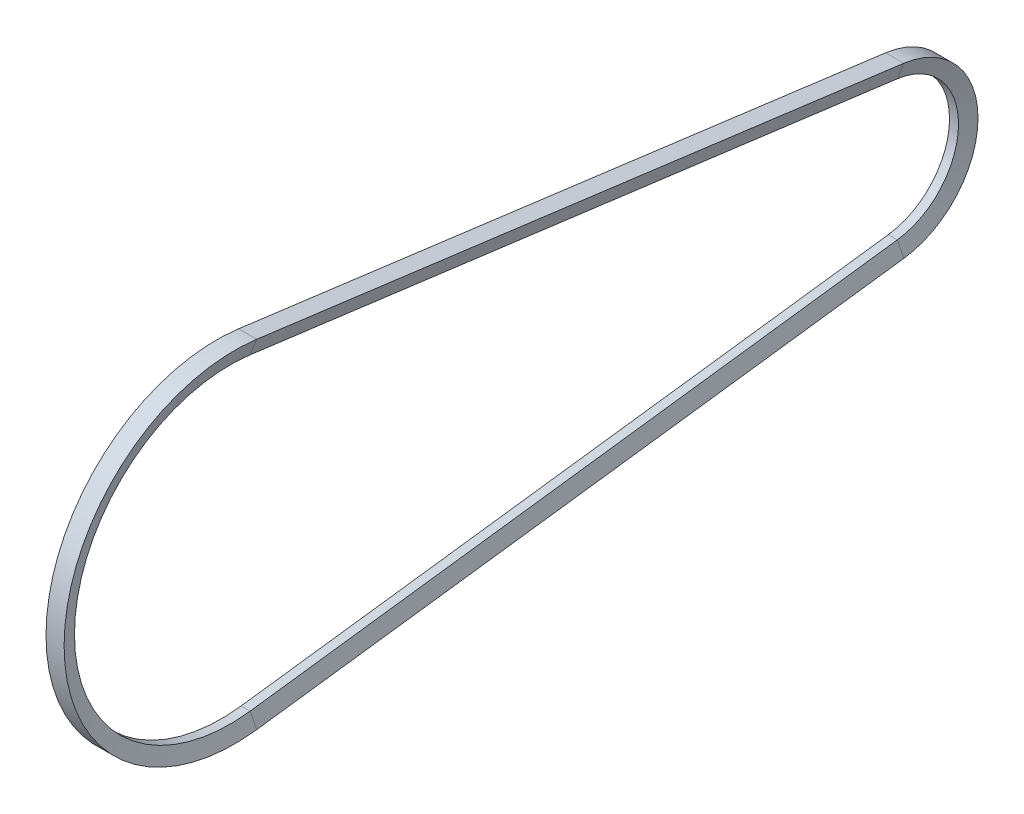
ISO-10303-21;
HEADER;
FILE_DESCRIPTION(('STEP AP214'),'2;1');
FILE_NAME('part.step','',(''),(''),'','','');
FILE_SCHEMA(('AUTOMOTIVE_DESIGN { 1 0 10303 214 1 1 1 1 }'));
ENDSEC;
DATA;
#1=APPLICATION_CONTEXT('core data for automotive mechanical design processes');
#2=APPLICATION_PROTOCOL_DEFINITION('international standard','automotive_design',2000,#1);
#3=PRODUCT_CONTEXT('',#1,'mechanical');
#4=PRODUCT('Part','Part','',(#3));
#5=PRODUCT_RELATED_PRODUCT_CATEGORY('part','',(#4));
#6=PRODUCT_DEFINITION_FORMATION('','',#4);
#7=PRODUCT_DEFINITION_CONTEXT('part definition',#1,'design');
#8=PRODUCT_DEFINITION('design','',#6,#7);
#9=PRODUCT_DEFINITION_SHAPE('','',#8);
#10=(LENGTH_UNIT() NAMED_UNIT(*) SI_UNIT(.MILLI.,.METRE.));
#11=(NAMED_UNIT(*) PLANE_ANGLE_UNIT() SI_UNIT($,.RADIAN.));
#12=(NAMED_UNIT(*) SI_UNIT($,.STERADIAN.) SOLID_ANGLE_UNIT());
#13=UNCERTAINTY_MEASURE_WITH_UNIT(LENGTH_MEASURE(1.E-05),#10,'distance_accuracy_value','');
#14=(GEOMETRIC_REPRESENTATION_CONTEXT(3) GLOBAL_UNCERTAINTY_ASSIGNED_CONTEXT((#13)) GLOBAL_UNIT_ASSIGNED_CONTEXT((#10,
#11,#12)) REPRESENTATION_CONTEXT('',''));
#15=CARTESIAN_POINT('',(0.,0.,0.));
#16=DIRECTION('',(0.,0.,1.));
#17=DIRECTION('',(1.,0.,0.));
#18=AXIS2_PLACEMENT_3D('',#15,#16,#17);
#19=CARTESIAN_POINT('',(2.10988522978939,32.7220480750426,-313.114057764537));
#20=DIRECTION('',(0.,-0.991577214395226,0.129516901955705));
#21=DIRECTION('',(0.,-0.129516901955705,-0.991577214395226));
#22=AXIS2_PLACEMENT_3D('',#19,#20,#21);
#23=PLANE('',#22);
#24=DIRECTION('',(1.,0.,0.));
#25=VECTOR('',#24,1.);
#26=CARTESIAN_POINT('',(2.10988522978939,32.7220480750426,-313.114057764537));
#27=LINE('',#26,#25);
#28=CARTESIAN_POINT('',(-2.10988522978939,32.7220480750426,-313.114057764537));
#29=VERTEX_POINT('',#28);
#30=CARTESIAN_POINT('',(2.10988522978939,32.7220480750426,-313.114057764537));
#31=VERTEX_POINT('',#30);
#32=EDGE_CURVE('E163',#29,#31,#27,.T.);
#33=ORIENTED_EDGE('',*,*,#32,.T.);
#34=DIRECTION('',(0.,0.129516901955705,0.991577214395226));
#35=VECTOR('',#34,1.);
#36=CARTESIAN_POINT('',(2.10988522978939,32.7220480750426,-313.114057764537));
#37=LINE('',#36,#35);
#38=CARTESIAN_POINT('',(2.10988522978939,72.3851366508516,-9.45473384276546));
#39=VERTEX_POINT('',#38);
#40=EDGE_CURVE('E44',#31,#39,#37,.T.);
#41=ORIENTED_EDGE('',*,*,#40,.T.);
#42=DIRECTION('',(1.,0.,0.));
#43=VECTOR('',#42,1.);
#44=CARTESIAN_POINT('',(2.10988522978939,72.3851366508516,-9.45473384276546));
#45=LINE('',#44,#43);
#46=CARTESIAN_POINT('',(-2.10988522978939,72.3851366508516,-9.45473384276546));
#47=VERTEX_POINT('',#46);
#48=EDGE_CURVE('E184',#47,#39,#45,.T.);
#49=ORIENTED_EDGE('',*,*,#48,.F.);
#50=DIRECTION('',(0.,0.129516901955705,0.991577214395226));
#51=VECTOR('',#50,1.);
#52=CARTESIAN_POINT('',(-2.10988522978939,32.7220480750426,-313.114057764537));
#53=LINE('',#52,#51);
#54=EDGE_CURVE('E11',#29,#47,#53,.T.);
#55=ORIENTED_EDGE('',*,*,#54,.F.);
#56=EDGE_LOOP('',(#33,#41,#49,#55));
#57=FACE_BOUND('',#56,.T.);
#58=ADVANCED_FACE('F36',(#57),#23,.T.);
#59=CARTESIAN_POINT('',(4.25,39.6630885758092,-314.020676078227));
#60=DIRECTION('',(0.956304755963036,-0.289909120536953,0.0378670774151968));
#61=DIRECTION('',(0.290117196934996,0.956991124328006,0.));
#62=AXIS2_PLACEMENT_3D('',#59,#60,#61);
#63=PLANE('',#62);
#64=DIRECTION('',(0.292371704722735,0.948250006030736,-0.123857629317825));
#65=VECTOR('',#64,1.);
#66=CARTESIAN_POINT('',(4.25,39.6630885758092,-314.020676078227));
#67=LINE('',#66,#65);
#68=CARTESIAN_POINT('',(4.25,39.6630885758092,-314.020676078227));
#69=VERTEX_POINT('',#68);
#70=EDGE_CURVE('E160',#31,#69,#67,.T.);
#71=ORIENTED_EDGE('',*,*,#70,.T.);
#72=DIRECTION('',(0.,0.129516901955705,0.991577214395226));
#73=VECTOR('',#72,1.);
#74=CARTESIAN_POINT('',(4.25,39.6630885758092,-314.020676078227));
#75=LINE('',#74,#73);
#76=CARTESIAN_POINT('',(4.25,79.3261771516182,-10.3613521564553));
#77=VERTEX_POINT('',#76);
#78=EDGE_CURVE('E189',#69,#77,#75,.T.);
#79=ORIENTED_EDGE('',*,*,#78,.T.);
#80=DIRECTION('',(0.292371704722735,0.948250006030736,-0.123857629317825));
#81=VECTOR('',#80,1.);
#82=CARTESIAN_POINT('',(4.25,79.3261771516182,-10.3613521564553));
#83=LINE('',#82,#81);
#84=EDGE_CURVE('E182',#39,#77,#83,.T.);
#85=ORIENTED_EDGE('',*,*,#84,.F.);
#86=ORIENTED_EDGE('',*,*,#40,.F.);
#87=EDGE_LOOP('',(#71,#79,#85,#86));
#88=FACE_BOUND('',#87,.T.);
#89=ADVANCED_FACE('F213',(#88),#63,.T.);
#90=CARTESIAN_POINT('',(-4.25,39.6630885758092,-314.020676078227));
#91=DIRECTION('',(0.,0.991577214395226,-0.129516901955705));
#92=DIRECTION('',(0.,0.129516901955705,0.991577214395226));
#93=AXIS2_PLACEMENT_3D('',#90,#91,#92);
#94=PLANE('',#93);
#95=DIRECTION('',(-1.,0.,0.));
#96=VECTOR('',#95,1.);
#97=CARTESIAN_POINT('',(-4.25,39.6630885758092,-314.020676078227));
#98=LINE('',#97,#96);
#99=CARTESIAN_POINT('',(-4.25,39.6630885758092,-314.020676078227));
#100=VERTEX_POINT('',#99);
#101=EDGE_CURVE('E157',#69,#100,#98,.T.);
#102=ORIENTED_EDGE('',*,*,#101,.T.);
#103=DIRECTION('',(0.,0.129516901955705,0.991577214395226));
#104=VECTOR('',#103,1.);
#105=CARTESIAN_POINT('',(-4.25,39.6630885758092,-314.020676078227));
#106=LINE('',#105,#104);
#107=CARTESIAN_POINT('',(-4.25,79.3261771516182,-10.3613521564553));
#108=VERTEX_POINT('',#107);
#109=EDGE_CURVE('E186',#100,#108,#106,.T.);
#110=ORIENTED_EDGE('',*,*,#109,.T.);
#111=DIRECTION('',(-1.,0.,0.));
#112=VECTOR('',#111,1.);
#113=CARTESIAN_POINT('',(-4.25,79.3261771516182,-10.3613521564553));
#114=LINE('',#113,#112);
#115=EDGE_CURVE('E179',#77,#108,#114,.T.);
#116=ORIENTED_EDGE('',*,*,#115,.F.);
#117=ORIENTED_EDGE('',*,*,#78,.F.);
#118=EDGE_LOOP('',(#102,#110,#116,#117));
#119=FACE_BOUND('',#118,.T.);
#120=ADVANCED_FACE('F212',(#119),#94,.T.);
#121=CARTESIAN_POINT('',(-2.10988522978939,32.7220480750426,-313.114057764537));
#122=DIRECTION('',(-0.956304755963036,-0.289909120536953,0.0378670774151968));
#123=DIRECTION('',(0.290117196934996,-0.956991124328006,0.));
#124=AXIS2_PLACEMENT_3D('',#121,#122,#123);
#125=PLANE('',#124);
#126=DIRECTION('',(0.292371704722735,-0.948250006030736,0.123857629317825));
#127=VECTOR('',#126,1.);
#128=CARTESIAN_POINT('',(-2.10988522978939,32.7220480750426,-313.114057764537));
#129=LINE('',#128,#127);
#130=EDGE_CURVE('E115',#100,#29,#129,.T.);
#131=ORIENTED_EDGE('',*,*,#130,.T.);
#132=ORIENTED_EDGE('',*,*,#54,.T.);
#133=DIRECTION('',(0.292371704722735,-0.948250006030736,0.123857629317825));
#134=VECTOR('',#133,1.);
#135=CARTESIAN_POINT('',(-2.10988522978939,72.3851366508516,-9.45473384276546));
#136=LINE('',#135,#134);
#137=EDGE_CURVE('E128',#108,#47,#136,.T.);
#138=ORIENTED_EDGE('',*,*,#137,.F.);
#139=ORIENTED_EDGE('',*,*,#109,.F.);
#140=EDGE_LOOP('',(#131,#132,#138,#139));
#141=FACE_BOUND('',#140,.T.);
#142=ADVANCED_FACE('F246',(#141),#125,.T.);
#143=CARTESIAN_POINT('',(0.,0.,-308.84));
#144=DIRECTION('',(1.,0.,0.));
#145=DIRECTION('',(0.,0.,-1.));
#146=AXIS2_PLACEMENT_3D('',#143,#144,#145);
#147=CYLINDRICAL_SURFACE('',#146,33.);
#148=DIRECTION('',(1.,0.,0.));
#149=VECTOR('',#148,1.);
#150=CARTESIAN_POINT('',(2.10988522978939,-32.7220480750423,-313.114057764539));
#151=LINE('',#150,#149);
#152=CARTESIAN_POINT('',(-2.10988522978939,-32.7220480750423,-313.114057764539));
#153=VERTEX_POINT('',#152);
#154=CARTESIAN_POINT('',(2.10988522978939,-32.7220480750423,-313.114057764539));
#155=VERTEX_POINT('',#154);
#156=EDGE_CURVE('E112',#153,#155,#151,.T.);
#157=ORIENTED_EDGE('',*,*,#156,.T.);
#158=CARTESIAN_POINT('',(2.10988522978939,0.,-308.84));
#159=DIRECTION('',(1.,0.,0.));
#160=DIRECTION('',(0.,0.,-1.));
#161=AXIS2_PLACEMENT_3D('',#158,#159,#160);
#162=CIRCLE('',#161,33.);
#163=EDGE_CURVE('E172',#155,#31,#162,.T.);
#164=ORIENTED_EDGE('',*,*,#163,.T.);
#165=ORIENTED_EDGE('',*,*,#32,.F.);
#166=CARTESIAN_POINT('',(-2.10988522978939,0.,-308.84));
#167=DIRECTION('',(1.,0.,0.));
#168=DIRECTION('',(0.,0.,-1.));
#169=AXIS2_PLACEMENT_3D('',#166,#167,#168);
#170=CIRCLE('',#169,33.);
#171=EDGE_CURVE('E175',#153,#29,#170,.T.);
#172=ORIENTED_EDGE('',*,*,#171,.F.);
#173=EDGE_LOOP('',(#157,#164,#165,#172));
#174=FACE_BOUND('',#173,.T.);
#175=ADVANCED_FACE('F243',(#174),#147,.F.);
#176=CARTESIAN_POINT('',(2.10988522978939,0.,-308.84));
#177=DIRECTION('',(1.,0.,0.));
#178=DIRECTION('',(0.,0.,-1.));
#179=AXIS2_PLACEMENT_3D('',#176,#177,#178);
#180=CONICAL_SURFACE('',#179,33.,1.27409035395586);
#181=DIRECTION('',(0.292371704722735,-0.948250006030732,-0.123857629317851));
#182=VECTOR('',#181,1.);
#183=CARTESIAN_POINT('',(4.25,-39.6630885758089,-314.020676078229));
#184=LINE('',#183,#182);
#185=CARTESIAN_POINT('',(4.25,-39.6630885758089,-314.020676078229));
#186=VERTEX_POINT('',#185);
#187=EDGE_CURVE('E146',#155,#186,#184,.T.);
#188=ORIENTED_EDGE('',*,*,#187,.T.);
#189=CARTESIAN_POINT('',(4.25,0.,-308.84));
#190=DIRECTION('',(1.,0.,0.));
#191=DIRECTION('',(0.,0.,-1.));
#192=AXIS2_PLACEMENT_3D('',#189,#190,#191);
#193=CIRCLE('',#192,40.);
#194=EDGE_CURVE('E169',#186,#69,#193,.T.);
#195=ORIENTED_EDGE('',*,*,#194,.T.);
#196=ORIENTED_EDGE('',*,*,#70,.F.);
#197=ORIENTED_EDGE('',*,*,#163,.F.);
#198=EDGE_LOOP('',(#188,#195,#196,#197));
#199=FACE_BOUND('',#198,.T.);
#200=ADVANCED_FACE('F220',(#199),#180,.F.);
#201=CARTESIAN_POINT('',(0.,0.,-308.84));
#202=DIRECTION('',(1.,0.,0.));
#203=DIRECTION('',(0.,0.,-1.));
#204=AXIS2_PLACEMENT_3D('',#201,#202,#203);
#205=CYLINDRICAL_SURFACE('',#204,40.);
#206=DIRECTION('',(-1.,0.,0.));
#207=VECTOR('',#206,1.);
#208=CARTESIAN_POINT('',(-4.25,-39.6630885758089,-314.020676078229));
#209=LINE('',#208,#207);
#210=CARTESIAN_POINT('',(-4.25,-39.6630885758089,-314.020676078229));
#211=VERTEX_POINT('',#210);
#212=EDGE_CURVE('E142',#186,#211,#209,.T.);
#213=ORIENTED_EDGE('',*,*,#212,.T.);
#214=CARTESIAN_POINT('',(-4.25,0.,-308.84));
#215=DIRECTION('',(1.,0.,0.));
#216=DIRECTION('',(0.,0.,-1.));
#217=AXIS2_PLACEMENT_3D('',#214,#215,#216);
#218=CIRCLE('',#217,40.);
#219=EDGE_CURVE('E166',#211,#100,#218,.T.);
#220=ORIENTED_EDGE('',*,*,#219,.T.);
#221=ORIENTED_EDGE('',*,*,#101,.F.);
#222=ORIENTED_EDGE('',*,*,#194,.F.);
#223=EDGE_LOOP('',(#213,#220,#221,#222));
#224=FACE_BOUND('',#223,.T.);
#225=ADVANCED_FACE('F218',(#224),#205,.T.);
#226=CARTESIAN_POINT('',(-4.25,0.,-308.84));
#227=DIRECTION('',(-1.,0.,0.));
#228=DIRECTION('',(0.,0.,1.));
#229=AXIS2_PLACEMENT_3D('',#226,#227,#228);
#230=CONICAL_SURFACE('',#229,40.,1.27409035395586);
#231=DIRECTION('',(0.292371704722735,0.948250006030732,0.123857629317851));
#232=VECTOR('',#231,1.);
#233=CARTESIAN_POINT('',(-2.10988522978939,-32.7220480750423,-313.114057764539));
#234=LINE('',#233,#232);
#235=EDGE_CURVE('E139',#211,#153,#234,.T.);
#236=ORIENTED_EDGE('',*,*,#235,.T.);
#237=ORIENTED_EDGE('',*,*,#171,.T.);
#238=ORIENTED_EDGE('',*,*,#130,.F.);
#239=ORIENTED_EDGE('',*,*,#219,.F.);
#240=EDGE_LOOP('',(#236,#237,#238,#239));
#241=FACE_BOUND('',#240,.T.);
#242=ADVANCED_FACE('F234',(#241),#230,.F.);
#243=CARTESIAN_POINT('',(2.10988522978939,-72.3851366508514,-9.45473384276748));
#244=DIRECTION('',(0.,0.991577214395226,0.129516901955705));
#245=DIRECTION('',(0.,-0.129516901955705,0.991577214395226));
#246=AXIS2_PLACEMENT_3D('',#243,#244,#245);
#247=PLANE('',#246);
#248=DIRECTION('',(1.,0.,0.));
#249=VECTOR('',#248,1.);
#250=CARTESIAN_POINT('',(2.10988522978939,-72.3851366508514,-9.45473384276748));
#251=LINE('',#250,#249);
#252=CARTESIAN_POINT('',(-2.10988522978939,-72.3851366508514,-9.45473384276748));
#253=VERTEX_POINT('',#252);
#254=CARTESIAN_POINT('',(2.10988522978939,-72.3851366508514,-9.45473384276748));
#255=VERTEX_POINT('',#254);
#256=EDGE_CURVE('E110',#253,#255,#251,.T.);
#257=ORIENTED_EDGE('',*,*,#256,.T.);
#258=DIRECTION('',(0.,0.129516901955705,-0.991577214395226));
#259=VECTOR('',#258,1.);
#260=CARTESIAN_POINT('',(2.10988522978939,-72.3851366508514,-9.45473384276748));
#261=LINE('',#260,#259);
#262=EDGE_CURVE('E116',#255,#155,#261,.T.);
#263=ORIENTED_EDGE('',*,*,#262,.T.);
#264=ORIENTED_EDGE('',*,*,#156,.F.);
#265=DIRECTION('',(0.,0.129516901955705,-0.991577214395226));
#266=VECTOR('',#265,1.);
#267=CARTESIAN_POINT('',(-2.10988522978939,-72.3851366508514,-9.45473384276748));
#268=LINE('',#267,#266);
#269=EDGE_CURVE('E106',#253,#153,#268,.T.);
#270=ORIENTED_EDGE('',*,*,#269,.F.);
#271=EDGE_LOOP('',(#257,#263,#264,#270));
#272=FACE_BOUND('',#271,.T.);
#273=ADVANCED_FACE('F108',(#272),#247,.T.);
#274=CARTESIAN_POINT('',(4.25,-79.326177151618,-10.3613521564575));
#275=DIRECTION('',(0.956304755963036,0.289909120536953,0.0378670774151968));
#276=DIRECTION('',(-0.290117196934996,0.956991124328006,0.));
#277=AXIS2_PLACEMENT_3D('',#274,#275,#276);
#278=PLANE('',#277);
#279=DIRECTION('',(0.292371704722735,-0.948250006030732,-0.123857629317851));
#280=VECTOR('',#279,1.);
#281=CARTESIAN_POINT('',(4.25,-79.326177151618,-10.3613521564575));
#282=LINE('',#281,#280);
#283=CARTESIAN_POINT('',(4.25,-79.326177151618,-10.3613521564575));
#284=VERTEX_POINT('',#283);
#285=EDGE_CURVE('E133',#255,#284,#282,.T.);
#286=ORIENTED_EDGE('',*,*,#285,.T.);
#287=DIRECTION('',(0.,0.129516901955705,-0.991577214395226));
#288=VECTOR('',#287,1.);
#289=CARTESIAN_POINT('',(4.25,-79.326177151618,-10.3613521564575));
#290=LINE('',#289,#288);
#291=EDGE_CURVE('E151',#284,#186,#290,.T.);
#292=ORIENTED_EDGE('',*,*,#291,.T.);
#293=ORIENTED_EDGE('',*,*,#187,.F.);
#294=ORIENTED_EDGE('',*,*,#262,.F.);
#295=EDGE_LOOP('',(#286,#292,#293,#294));
#296=FACE_BOUND('',#295,.T.);
#297=ADVANCED_FACE('F226',(#296),#278,.T.);
#298=CARTESIAN_POINT('',(-4.25,-79.326177151618,-10.3613521564575));
#299=DIRECTION('',(0.,-0.991577214395226,-0.129516901955705));
#300=DIRECTION('',(0.,0.129516901955705,-0.991577214395226));
#301=AXIS2_PLACEMENT_3D('',#298,#299,#300);
#302=PLANE('',#301);
#303=DIRECTION('',(-1.,0.,0.));
#304=VECTOR('',#303,1.);
#305=CARTESIAN_POINT('',(-4.25,-79.326177151618,-10.3613521564575));
#306=LINE('',#305,#304);
#307=CARTESIAN_POINT('',(-4.25,-79.326177151618,-10.3613521564575));
#308=VERTEX_POINT('',#307);
#309=EDGE_CURVE('E130',#284,#308,#306,.T.);
#310=ORIENTED_EDGE('',*,*,#309,.T.);
#311=DIRECTION('',(0.,0.129516901955705,-0.991577214395226));
#312=VECTOR('',#311,1.);
#313=CARTESIAN_POINT('',(-4.25,-79.326177151618,-10.3613521564575));
#314=LINE('',#313,#312);
#315=EDGE_CURVE('E122',#308,#211,#314,.T.);
#316=ORIENTED_EDGE('',*,*,#315,.T.);
#317=ORIENTED_EDGE('',*,*,#212,.F.);
#318=ORIENTED_EDGE('',*,*,#291,.F.);
#319=EDGE_LOOP('',(#310,#316,#317,#318));
#320=FACE_BOUND('',#319,.T.);
#321=ADVANCED_FACE('F225',(#320),#302,.T.);
#322=CARTESIAN_POINT('',(-2.10988522978939,-72.3851366508514,-9.45473384276748));
#323=DIRECTION('',(-0.956304755963036,0.289909120536953,0.0378670774151968));
#324=DIRECTION('',(-0.290117196934996,-0.956991124328006,0.));
#325=AXIS2_PLACEMENT_3D('',#322,#323,#324);
#326=PLANE('',#325);
#327=DIRECTION('',(0.292371704722735,0.948250006030732,0.123857629317851));
#328=VECTOR('',#327,1.);
#329=CARTESIAN_POINT('',(-2.10988522978939,-72.3851366508514,-9.45473384276748));
#330=LINE('',#329,#328);
#331=EDGE_CURVE('E119',#308,#253,#330,.T.);
#332=ORIENTED_EDGE('',*,*,#331,.T.);
#333=ORIENTED_EDGE('',*,*,#269,.T.);
#334=ORIENTED_EDGE('',*,*,#235,.F.);
#335=ORIENTED_EDGE('',*,*,#315,.F.);
#336=EDGE_LOOP('',(#332,#333,#334,#335));
#337=FACE_BOUND('',#336,.T.);
#338=ADVANCED_FACE('F120',(#337),#326,.T.);
#339=CARTESIAN_POINT('',(-4.25,0.,0.));
#340=DIRECTION('',(-1.,0.,0.));
#341=DIRECTION('',(0.,0.,1.));
#342=AXIS2_PLACEMENT_3D('',#339,#340,#341);
#343=CONICAL_SURFACE('',#342,80.,1.27409035395586);
#344=CARTESIAN_POINT('',(-4.25,0.,0.));
#345=DIRECTION('',(-1.,0.,0.));
#346=DIRECTION('',(0.,0.,1.));
#347=AXIS2_PLACEMENT_3D('',#344,#345,#346);
#348=CIRCLE('',#347,80.);
#349=EDGE_CURVE('E143',#308,#108,#348,.T.);
#350=ORIENTED_EDGE('',*,*,#349,.T.);
#351=ORIENTED_EDGE('',*,*,#137,.T.);
#352=CARTESIAN_POINT('',(-2.10988522978939,0.,0.));
#353=DIRECTION('',(-1.,0.,0.));
#354=DIRECTION('',(0.,0.,1.));
#355=AXIS2_PLACEMENT_3D('',#352,#353,#354);
#356=CIRCLE('',#355,73.);
#357=EDGE_CURVE('E52',#253,#47,#356,.T.);
#358=ORIENTED_EDGE('',*,*,#357,.F.);
#359=ORIENTED_EDGE('',*,*,#331,.F.);
#360=EDGE_LOOP('',(#350,#351,#358,#359));
#361=FACE_BOUND('',#360,.T.);
#362=ADVANCED_FACE('F126',(#361),#343,.F.);
#363=CARTESIAN_POINT('',(0.,0.,0.));
#364=DIRECTION('',(-1.,0.,0.));
#365=DIRECTION('',(0.,0.,1.));
#366=AXIS2_PLACEMENT_3D('',#363,#364,#365);
#367=CYLINDRICAL_SURFACE('',#366,80.);
#368=CARTESIAN_POINT('',(4.25,0.,0.));
#369=DIRECTION('',(-1.,0.,0.));
#370=DIRECTION('',(0.,0.,1.));
#371=AXIS2_PLACEMENT_3D('',#368,#369,#370);
#372=CIRCLE('',#371,80.);
#373=EDGE_CURVE('E197',#284,#77,#372,.T.);
#374=ORIENTED_EDGE('',*,*,#373,.T.);
#375=ORIENTED_EDGE('',*,*,#115,.T.);
#376=ORIENTED_EDGE('',*,*,#349,.F.);
#377=ORIENTED_EDGE('',*,*,#309,.F.);
#378=EDGE_LOOP('',(#374,#375,#376,#377));
#379=FACE_BOUND('',#378,.T.);
#380=ADVANCED_FACE('F205',(#379),#367,.T.);
#381=CARTESIAN_POINT('',(2.10988522978939,0.,0.));
#382=DIRECTION('',(1.,0.,0.));
#383=DIRECTION('',(0.,0.,-1.));
#384=AXIS2_PLACEMENT_3D('',#381,#382,#383);
#385=CONICAL_SURFACE('',#384,73.,1.27409035395586);
#386=CARTESIAN_POINT('',(2.10988522978939,0.,0.));
#387=DIRECTION('',(-1.,0.,0.));
#388=DIRECTION('',(0.,0.,1.));
#389=AXIS2_PLACEMENT_3D('',#386,#387,#388);
#390=CIRCLE('',#389,73.);
#391=EDGE_CURVE('E60',#255,#39,#390,.T.);
#392=ORIENTED_EDGE('',*,*,#391,.T.);
#393=ORIENTED_EDGE('',*,*,#84,.T.);
#394=ORIENTED_EDGE('',*,*,#373,.F.);
#395=ORIENTED_EDGE('',*,*,#285,.F.);
#396=EDGE_LOOP('',(#392,#393,#394,#395));
#397=FACE_BOUND('',#396,.T.);
#398=ADVANCED_FACE('F209',(#397),#385,.F.);
#399=CARTESIAN_POINT('',(0.,0.,0.));
#400=DIRECTION('',(-1.,0.,0.));
#401=DIRECTION('',(0.,0.,1.));
#402=AXIS2_PLACEMENT_3D('',#399,#400,#401);
#403=CYLINDRICAL_SURFACE('',#402,73.);
#404=ORIENTED_EDGE('',*,*,#256,.F.);
#405=ORIENTED_EDGE('',*,*,#357,.T.);
#406=ORIENTED_EDGE('',*,*,#48,.T.);
#407=ORIENTED_EDGE('',*,*,#391,.F.);
#408=EDGE_LOOP('',(#404,#405,#406,#407));
#409=FACE_BOUND('',#408,.T.);
#410=ADVANCED_FACE('F132',(#409),#403,.F.);
#411=CLOSED_SHELL('',(#58,#89,#120,#142,#175,#200,#225,#242,#273,#297,#321,#338,#362,#380,#398,#410));
#412=MANIFOLD_SOLID_BREP('B2',#411);
#413=ADVANCED_BREP_SHAPE_REPRESENTATION('',(#18,#412),#14);
#414=SHAPE_DEFINITION_REPRESENTATION(#9,#413);
ENDSEC;
END-ISO-10303-21;
